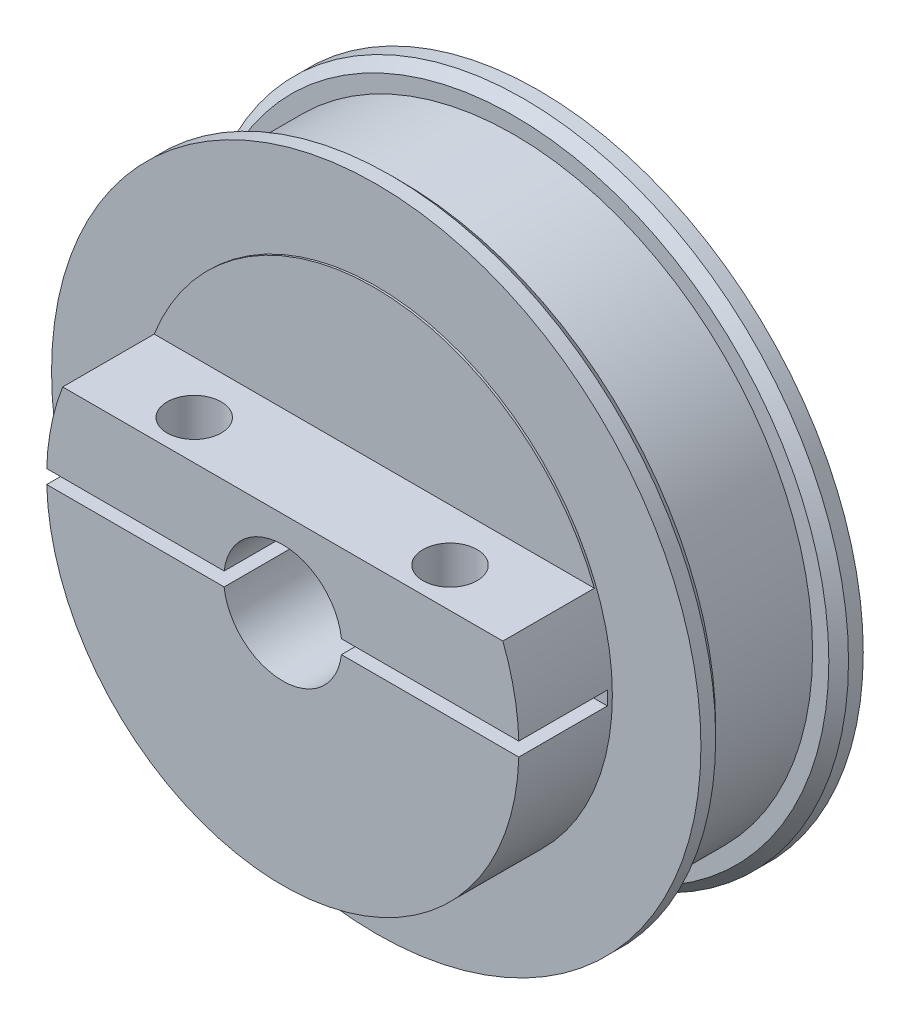
ISO-10303-21;
HEADER;
FILE_DESCRIPTION(('STEP AP214'),'2;1');
FILE_NAME('part.step','',(''),(''),'','','');
FILE_SCHEMA(('AUTOMOTIVE_DESIGN { 1 0 10303 214 1 1 1 1 }'));
ENDSEC;
DATA;
#1=APPLICATION_CONTEXT('core data for automotive mechanical design processes');
#2=APPLICATION_PROTOCOL_DEFINITION('international standard','automotive_design',2000,#1);
#3=PRODUCT_CONTEXT('',#1,'mechanical');
#4=PRODUCT('Part','Part','',(#3));
#5=PRODUCT_RELATED_PRODUCT_CATEGORY('part','',(#4));
#6=PRODUCT_DEFINITION_FORMATION('','',#4);
#7=PRODUCT_DEFINITION_CONTEXT('part definition',#1,'design');
#8=PRODUCT_DEFINITION('design','',#6,#7);
#9=PRODUCT_DEFINITION_SHAPE('','',#8);
#10=(LENGTH_UNIT() NAMED_UNIT(*) SI_UNIT(.MILLI.,.METRE.));
#11=(NAMED_UNIT(*) PLANE_ANGLE_UNIT() SI_UNIT($,.RADIAN.));
#12=(NAMED_UNIT(*) SI_UNIT($,.STERADIAN.) SOLID_ANGLE_UNIT());
#13=UNCERTAINTY_MEASURE_WITH_UNIT(LENGTH_MEASURE(1.E-05),#10,'distance_accuracy_value','');
#14=(GEOMETRIC_REPRESENTATION_CONTEXT(3) GLOBAL_UNCERTAINTY_ASSIGNED_CONTEXT((#13)) GLOBAL_UNIT_ASSIGNED_CONTEXT((#10,
#11,#12)) REPRESENTATION_CONTEXT('',''));
#15=CARTESIAN_POINT('',(0.,0.,0.));
#16=DIRECTION('',(0.,0.,1.));
#17=DIRECTION('',(1.,0.,0.));
#18=AXIS2_PLACEMENT_3D('',#15,#16,#17);
#19=CARTESIAN_POINT('',(0.,0.,26.));
#20=DIRECTION('',(0.,0.,1.));
#21=DIRECTION('',(1.,0.,0.));
#22=AXIS2_PLACEMENT_3D('',#19,#20,#21);
#23=PLANE('',#22);
#24=DIRECTION('',(1.,0.,0.));
#25=VECTOR('',#24,1.);
#26=CARTESIAN_POINT('',(0.,8.7,26.));
#27=LINE('',#26,#25);
#28=CARTESIAN_POINT('',(-22.3676105116304,8.7,26.));
#29=VERTEX_POINT('',#28);
#30=CARTESIAN_POINT('',(22.3676105116304,8.7,26.));
#31=VERTEX_POINT('',#30);
#32=EDGE_CURVE('E110',#29,#31,#27,.T.);
#33=ORIENTED_EDGE('',*,*,#32,.F.);
#34=CARTESIAN_POINT('',(0.,0.,26.));
#35=DIRECTION('',(0.,0.,1.));
#36=DIRECTION('',(1.,0.,0.));
#37=AXIS2_PLACEMENT_3D('',#34,#35,#36);
#38=CIRCLE('',#37,24.);
#39=CARTESIAN_POINT('',(-23.9897894946996,0.699999999999999,26.));
#40=VERTEX_POINT('',#39);
#41=EDGE_CURVE('E114',#29,#40,#38,.T.);
#42=ORIENTED_EDGE('',*,*,#41,.T.);
#43=DIRECTION('',(-1.,0.,0.));
#44=VECTOR('',#43,1.);
#45=CARTESIAN_POINT('',(-25.,0.699999999999999,26.));
#46=LINE('',#45,#44);
#47=CARTESIAN_POINT('',(-5.95902676617583,0.700000000000001,26.));
#48=VERTEX_POINT('',#47);
#49=EDGE_CURVE('E456',#48,#40,#46,.T.);
#50=ORIENTED_EDGE('',*,*,#49,.F.);
#51=CARTESIAN_POINT('',(0.,0.,26.));
#52=DIRECTION('',(0.,0.,1.));
#53=DIRECTION('',(1.,0.,0.));
#54=AXIS2_PLACEMENT_3D('',#51,#52,#53);
#55=CIRCLE('',#54,6.);
#56=CARTESIAN_POINT('',(5.95902676617583,0.700000000000003,26.));
#57=VERTEX_POINT('',#56);
#58=EDGE_CURVE('E148',#57,#48,#55,.T.);
#59=ORIENTED_EDGE('',*,*,#58,.F.);
#60=CARTESIAN_POINT('',(23.9897894946996,0.700000000000005,26.));
#61=VERTEX_POINT('',#60);
#62=EDGE_CURVE('E455',#61,#57,#46,.T.);
#63=ORIENTED_EDGE('',*,*,#62,.F.);
#64=EDGE_CURVE('E118',#61,#31,#38,.T.);
#65=ORIENTED_EDGE('',*,*,#64,.T.);
#66=EDGE_LOOP('',(#33,#42,#50,#59,#63,#65));
#67=FACE_BOUND('',#66,.T.);
#68=ADVANCED_FACE('F35',(#67),#23,.T.);
#69=CARTESIAN_POINT('',(0.,0.,16.5));
#70=DIRECTION('',(0.,0.,1.));
#71=DIRECTION('',(1.,0.,0.));
#72=AXIS2_PLACEMENT_3D('',#69,#70,#71);
#73=PLANE('',#72);
#74=CARTESIAN_POINT('',(0.,0.,16.5));
#75=DIRECTION('',(0.,0.,1.));
#76=DIRECTION('',(1.,0.,0.));
#77=AXIS2_PLACEMENT_3D('',#74,#75,#76);
#78=CIRCLE('',#77,33.);
#79=CARTESIAN_POINT('',(33.,0.,16.5));
#80=VERTEX_POINT('',#79);
#81=EDGE_CURVE('E143',#80,#80,#78,.T.);
#82=ORIENTED_EDGE('',*,*,#81,.T.);
#83=EDGE_LOOP('',(#82));
#84=FACE_BOUND('',#83,.T.);
#85=CARTESIAN_POINT('',(0.,0.,16.5));
#86=DIRECTION('',(0.,0.,1.));
#87=DIRECTION('',(1.,0.,0.));
#88=AXIS2_PLACEMENT_3D('',#85,#86,#87);
#89=CIRCLE('',#88,24.);
#90=CARTESIAN_POINT('',(24.,0.,16.5));
#91=VERTEX_POINT('',#90);
#92=EDGE_CURVE('E145',#91,#91,#89,.T.);
#93=ORIENTED_EDGE('',*,*,#92,.F.);
#94=EDGE_LOOP('',(#93));
#95=FACE_BOUND('',#94,.T.);
#96=ADVANCED_FACE('F252',(#84,#95),#73,.T.);
#97=CARTESIAN_POINT('',(0.,0.,2.5));
#98=DIRECTION('',(0.,0.,1.));
#99=DIRECTION('',(1.,0.,0.));
#100=AXIS2_PLACEMENT_3D('',#97,#98,#99);
#101=PLANE('',#100);
#102=CARTESIAN_POINT('',(0.,0.,2.5));
#103=DIRECTION('',(0.,0.,1.));
#104=DIRECTION('',(1.,0.,0.));
#105=AXIS2_PLACEMENT_3D('',#102,#103,#104);
#106=CIRCLE('',#105,32.);
#107=CARTESIAN_POINT('',(32.,0.,2.5));
#108=VERTEX_POINT('',#107);
#109=EDGE_CURVE('E164',#108,#108,#106,.T.);
#110=ORIENTED_EDGE('',*,*,#109,.T.);
#111=EDGE_LOOP('',(#110));
#112=FACE_BOUND('',#111,.T.);
#113=CARTESIAN_POINT('',(0.,0.,2.5));
#114=DIRECTION('',(0.,0.,1.));
#115=DIRECTION('',(1.,0.,0.));
#116=AXIS2_PLACEMENT_3D('',#113,#114,#115);
#117=CIRCLE('',#116,30.35);
#118=CARTESIAN_POINT('',(30.35,0.,2.5));
#119=VERTEX_POINT('',#118);
#120=EDGE_CURVE('E155',#119,#119,#117,.T.);
#121=ORIENTED_EDGE('',*,*,#120,.F.);
#122=EDGE_LOOP('',(#121));
#123=FACE_BOUND('',#122,.T.);
#124=ADVANCED_FACE('F256',(#112,#123),#101,.T.);
#125=CARTESIAN_POINT('',(0.,0.,2.5));
#126=DIRECTION('',(0.,0.,-1.));
#127=DIRECTION('',(-1.,0.,0.));
#128=AXIS2_PLACEMENT_3D('',#125,#126,#127);
#129=CYLINDRICAL_SURFACE('',#128,33.);
#130=CARTESIAN_POINT('',(0.,0.,1.49999999999999));
#131=DIRECTION('',(0.,0.,1.));
#132=DIRECTION('',(1.,0.,0.));
#133=AXIS2_PLACEMENT_3D('',#130,#131,#132);
#134=CIRCLE('',#133,33.);
#135=CARTESIAN_POINT('',(33.,0.,1.49999999999999));
#136=VERTEX_POINT('',#135);
#137=EDGE_CURVE('E167',#136,#136,#134,.F.);
#138=ORIENTED_EDGE('',*,*,#137,.T.);
#139=EDGE_LOOP('',(#138));
#140=FACE_BOUND('',#139,.T.);
#141=CARTESIAN_POINT('',(0.,0.,0.));
#142=DIRECTION('',(0.,0.,1.));
#143=DIRECTION('',(1.,0.,0.));
#144=AXIS2_PLACEMENT_3D('',#141,#142,#143);
#145=CIRCLE('',#144,33.);
#146=CARTESIAN_POINT('',(33.,0.,0.));
#147=VERTEX_POINT('',#146);
#148=EDGE_CURVE('E159',#147,#147,#145,.T.);
#149=ORIENTED_EDGE('',*,*,#148,.T.);
#150=EDGE_LOOP('',(#149));
#151=FACE_BOUND('',#150,.T.);
#152=ADVANCED_FACE('F261',(#140,#151),#129,.T.);
#153=CARTESIAN_POINT('',(0.,0.,0.));
#154=DIRECTION('',(0.,0.,1.));
#155=DIRECTION('',(1.,0.,0.));
#156=AXIS2_PLACEMENT_3D('',#153,#154,#155);
#157=PLANE('',#156);
#158=CARTESIAN_POINT('',(0.,0.,0.));
#159=DIRECTION('',(0.,0.,1.));
#160=DIRECTION('',(1.,0.,0.));
#161=AXIS2_PLACEMENT_3D('',#158,#159,#160);
#162=CIRCLE('',#161,6.);
#163=CARTESIAN_POINT('',(6.,0.,0.));
#164=VERTEX_POINT('',#163);
#165=EDGE_CURVE('E152',#164,#164,#162,.T.);
#166=ORIENTED_EDGE('',*,*,#165,.T.);
#167=EDGE_LOOP('',(#166));
#168=FACE_BOUND('',#167,.T.);
#169=ORIENTED_EDGE('',*,*,#148,.F.);
#170=EDGE_LOOP('',(#169));
#171=FACE_BOUND('',#170,.T.);
#172=ADVANCED_FACE('F275',(#168,#171),#157,.F.);
#173=CARTESIAN_POINT('',(0.,0.,14.));
#174=DIRECTION('',(0.,0.,-1.));
#175=DIRECTION('',(-1.,0.,0.));
#176=AXIS2_PLACEMENT_3D('',#173,#174,#175);
#177=CYLINDRICAL_SURFACE('',#176,30.35);
#178=CARTESIAN_POINT('',(0.,0.,14.));
#179=DIRECTION('',(0.,0.,1.));
#180=DIRECTION('',(1.,0.,0.));
#181=AXIS2_PLACEMENT_3D('',#178,#179,#180);
#182=CIRCLE('',#181,30.35);
#183=CARTESIAN_POINT('',(30.35,0.,14.));
#184=VERTEX_POINT('',#183);
#185=EDGE_CURVE('E156',#184,#184,#182,.T.);
#186=ORIENTED_EDGE('',*,*,#185,.F.);
#187=EDGE_LOOP('',(#186));
#188=FACE_BOUND('',#187,.T.);
#189=ORIENTED_EDGE('',*,*,#120,.T.);
#190=EDGE_LOOP('',(#189));
#191=FACE_BOUND('',#190,.T.);
#192=ADVANCED_FACE('F269',(#188,#191),#177,.T.);
#193=CARTESIAN_POINT('',(0.,0.,14.));
#194=DIRECTION('',(0.,0.,1.));
#195=DIRECTION('',(1.,0.,0.));
#196=AXIS2_PLACEMENT_3D('',#193,#194,#195);
#197=PLANE('',#196);
#198=CARTESIAN_POINT('',(0.,0.,14.));
#199=DIRECTION('',(0.,0.,1.));
#200=DIRECTION('',(1.,0.,0.));
#201=AXIS2_PLACEMENT_3D('',#198,#199,#200);
#202=CIRCLE('',#201,32.);
#203=CARTESIAN_POINT('',(32.,0.,14.));
#204=VERTEX_POINT('',#203);
#205=EDGE_CURVE('E173',#204,#204,#202,.F.);
#206=ORIENTED_EDGE('',*,*,#205,.T.);
#207=EDGE_LOOP('',(#206));
#208=FACE_BOUND('',#207,.T.);
#209=ORIENTED_EDGE('',*,*,#185,.T.);
#210=EDGE_LOOP('',(#209));
#211=FACE_BOUND('',#210,.T.);
#212=ADVANCED_FACE('F266',(#208,#211),#197,.F.);
#213=CARTESIAN_POINT('',(0.,0.,16.5));
#214=DIRECTION('',(0.,0.,-1.));
#215=DIRECTION('',(-1.,0.,0.));
#216=AXIS2_PLACEMENT_3D('',#213,#214,#215);
#217=CYLINDRICAL_SURFACE('',#216,33.);
#218=CARTESIAN_POINT('',(0.,0.,15.));
#219=DIRECTION('',(0.,0.,1.));
#220=DIRECTION('',(1.,0.,0.));
#221=AXIS2_PLACEMENT_3D('',#218,#219,#220);
#222=CIRCLE('',#221,33.);
#223=CARTESIAN_POINT('',(33.,0.,15.));
#224=VERTEX_POINT('',#223);
#225=EDGE_CURVE('E170',#224,#224,#222,.T.);
#226=ORIENTED_EDGE('',*,*,#225,.T.);
#227=EDGE_LOOP('',(#226));
#228=FACE_BOUND('',#227,.T.);
#229=ORIENTED_EDGE('',*,*,#81,.F.);
#230=EDGE_LOOP('',(#229));
#231=FACE_BOUND('',#230,.T.);
#232=ADVANCED_FACE('F249',(#228,#231),#217,.T.);
#233=CARTESIAN_POINT('',(0.,0.,26.));
#234=DIRECTION('',(0.,0.,-1.));
#235=DIRECTION('',(-1.,0.,0.));
#236=AXIS2_PLACEMENT_3D('',#233,#234,#235);
#237=CYLINDRICAL_SURFACE('',#236,24.);
#238=ORIENTED_EDGE('',*,*,#41,.F.);
#239=DIRECTION('',(0.,0.,-1.));
#240=VECTOR('',#239,1.);
#241=CARTESIAN_POINT('',(-22.3676105116304,8.7,26.));
#242=LINE('',#241,#240);
#243=CARTESIAN_POINT('',(-22.3676105116304,8.7,16.7));
#244=VERTEX_POINT('',#243);
#245=EDGE_CURVE('E126',#29,#244,#242,.T.);
#246=ORIENTED_EDGE('',*,*,#245,.T.);
#247=CARTESIAN_POINT('',(0.,0.,16.7));
#248=DIRECTION('',(0.,0.,1.));
#249=DIRECTION('',(1.,0.,0.));
#250=AXIS2_PLACEMENT_3D('',#247,#248,#249);
#251=CIRCLE('',#250,24.);
#252=CARTESIAN_POINT('',(22.3676105116304,8.7,16.7));
#253=VERTEX_POINT('',#252);
#254=EDGE_CURVE('E11',#253,#244,#251,.T.);
#255=ORIENTED_EDGE('',*,*,#254,.F.);
#256=DIRECTION('',(0.,0.,-1.));
#257=VECTOR('',#256,1.);
#258=CARTESIAN_POINT('',(22.3676105116304,8.7,26.));
#259=LINE('',#258,#257);
#260=EDGE_CURVE('E134',#253,#31,#259,.F.);
#261=ORIENTED_EDGE('',*,*,#260,.T.);
#262=ORIENTED_EDGE('',*,*,#64,.F.);
#263=DIRECTION('',(0.,0.,-1.));
#264=VECTOR('',#263,1.);
#265=CARTESIAN_POINT('',(23.9897894946996,0.700000000000005,26.));
#266=LINE('',#265,#264);
#267=CARTESIAN_POINT('',(23.9897894946996,0.700000000000005,17.));
#268=VERTEX_POINT('',#267);
#269=EDGE_CURVE('E439',#61,#268,#266,.T.);
#270=ORIENTED_EDGE('',*,*,#269,.T.);
#271=CARTESIAN_POINT('',(0.,0.,17.));
#272=DIRECTION('',(0.,0.,1.));
#273=DIRECTION('',(1.,0.,0.));
#274=AXIS2_PLACEMENT_3D('',#271,#272,#273);
#275=CIRCLE('',#274,24.);
#276=CARTESIAN_POINT('',(23.9897894946996,-0.699999999999996,17.));
#277=VERTEX_POINT('',#276);
#278=EDGE_CURVE('E431',#277,#268,#275,.T.);
#279=ORIENTED_EDGE('',*,*,#278,.F.);
#280=DIRECTION('',(0.,0.,-1.));
#281=VECTOR('',#280,1.);
#282=CARTESIAN_POINT('',(23.9897894946996,-0.699999999999996,26.));
#283=LINE('',#282,#281);
#284=CARTESIAN_POINT('',(23.9897894946996,-0.699999999999996,26.));
#285=VERTEX_POINT('',#284);
#286=EDGE_CURVE('E463',#277,#285,#283,.F.);
#287=ORIENTED_EDGE('',*,*,#286,.T.);
#288=CARTESIAN_POINT('',(-23.9897894946996,-0.700000000000002,26.));
#289=VERTEX_POINT('',#288);
#290=EDGE_CURVE('E141',#289,#285,#38,.T.);
#291=ORIENTED_EDGE('',*,*,#290,.F.);
#292=DIRECTION('',(0.,0.,-1.));
#293=VECTOR('',#292,1.);
#294=CARTESIAN_POINT('',(-23.9897894946996,-0.700000000000002,26.));
#295=LINE('',#294,#293);
#296=CARTESIAN_POINT('',(-23.9897894946996,-0.700000000000002,17.));
#297=VERTEX_POINT('',#296);
#298=EDGE_CURVE('E446',#289,#297,#295,.T.);
#299=ORIENTED_EDGE('',*,*,#298,.T.);
#300=CARTESIAN_POINT('',(-23.9897894946996,0.699999999999999,17.));
#301=VERTEX_POINT('',#300);
#302=EDGE_CURVE('E436',#301,#297,#275,.T.);
#303=ORIENTED_EDGE('',*,*,#302,.F.);
#304=DIRECTION('',(0.,0.,-1.));
#305=VECTOR('',#304,1.);
#306=CARTESIAN_POINT('',(-23.9897894946996,0.699999999999999,26.));
#307=LINE('',#306,#305);
#308=EDGE_CURVE('E140',#301,#40,#307,.F.);
#309=ORIENTED_EDGE('',*,*,#308,.T.);
#310=EDGE_LOOP('',(#238,#246,#255,#261,#262,#270,#279,#287,#291,#299,#303,#309));
#311=FACE_BOUND('',#310,.T.);
#312=CARTESIAN_POINT('',(-13.,-20.174241001832,24.1));
#313=CARTESIAN_POINT('',(-12.849288157179,-20.2713551716352,24.0999969433963));
#314=CARTESIAN_POINT('',(-12.697399910894,-20.3668149132256,24.0837824875346));
#315=CARTESIAN_POINT('',(-12.3969170998205,-20.5510938041406,24.0174049459555));
#316=CARTESIAN_POINT('',(-12.2483212330184,-20.6399156127295,23.967255536972));
#317=CARTESIAN_POINT('',(-11.9794450419192,-20.7969731415149,23.8405754693289));
#318=CARTESIAN_POINT('',(-11.8579460485274,-20.8663944712,23.768121475505));
#319=CARTESIAN_POINT('',(-11.6287946661962,-20.9949601498911,23.596923542887));
#320=CARTESIAN_POINT('',(-11.5211225617998,-21.0541191749173,23.4982176673926));
#321=CARTESIAN_POINT('',(-11.340647640857,-21.1518011292401,23.2931950904712));
#322=CARTESIAN_POINT('',(-11.2650412040748,-21.1920838688733,23.1901845577408));
#323=CARTESIAN_POINT('',(-11.132723403254,-21.2618928667944,22.9694219540343));
#324=CARTESIAN_POINT('',(-11.0759923207704,-21.2914303533175,22.8516854448861));
#325=CARTESIAN_POINT('',(-10.9910384144899,-21.3353945059791,22.6221028742834));
#326=CARTESIAN_POINT('',(-10.9600200464264,-21.351312457034,22.5115702352565));
#327=CARTESIAN_POINT('',(-10.91640559265,-21.373645135915,22.2860101784045));
#328=CARTESIAN_POINT('',(-10.9037993499169,-21.3800651033143,22.170985274717));
#329=CARTESIAN_POINT('',(-10.8979046042035,-21.3830697980633,21.9489396954555));
#330=CARTESIAN_POINT('',(-10.9032457690739,-21.3803521928256,21.8419617133724));
#331=CARTESIAN_POINT('',(-10.9300050393064,-21.3666846539916,21.630590492442));
#332=CARTESIAN_POINT('',(-10.951420902534,-21.3557358684985,21.5261968952165));
#333=CARTESIAN_POINT('',(-11.0090880259167,-21.3260640926489,21.3237976015672));
#334=CARTESIAN_POINT('',(-11.0452067264089,-21.3074105463255,21.2257436712989));
#335=CARTESIAN_POINT('',(-11.1307404682853,-21.2628533245368,21.0374143255193));
#336=CARTESIAN_POINT('',(-11.1801574561433,-21.2369485876908,20.9471400512739));
#337=CARTESIAN_POINT('',(-11.2931045679551,-21.1771116034468,20.7720390165985));
#338=CARTESIAN_POINT('',(-11.3572081761813,-21.1428478554889,20.6876968445316));
#339=CARTESIAN_POINT('',(-11.4955887440155,-21.0679288837374,20.5310960825113));
#340=CARTESIAN_POINT('',(-11.5698690513904,-21.0272715560334,20.4588414863795));
#341=CARTESIAN_POINT('',(-11.7337800806294,-20.9362841464911,20.3209429566493));
#342=CARTESIAN_POINT('',(-11.8242001955834,-20.8853996206159,20.2566057106992));
#343=CARTESIAN_POINT('',(-12.0115461706161,-20.7782199434862,20.143949023162));
#344=CARTESIAN_POINT('',(-12.1084750536091,-20.7219222728498,20.0956370870652));
#345=CARTESIAN_POINT('',(-12.3189694389339,-20.5975666373773,20.0098469200332));
#346=CARTESIAN_POINT('',(-12.4330768783874,-20.5289255632783,19.9745454337949));
#347=CARTESIAN_POINT('',(-12.663254729758,-20.3877475645518,19.9238227623137));
#348=CARTESIAN_POINT('',(-12.7793260234728,-20.3152088562192,19.9084107613719));
#349=CARTESIAN_POINT('',(-13.0260507297157,-20.1580272850201,19.8960736228558));
#350=CARTESIAN_POINT('',(-13.1566238427027,-20.0730430295922,19.9018328384013));
#351=CARTESIAN_POINT('',(-13.4139287752807,-19.9020208685234,19.9371012230994));
#352=CARTESIAN_POINT('',(-13.5406569490221,-19.8159820651597,19.9666322451444));
#353=CARTESIAN_POINT('',(-13.7975281548705,-19.6380897708855,20.0522401057887));
#354=CARTESIAN_POINT('',(-13.9270881107708,-19.5463432522373,20.1103087733295));
#355=CARTESIAN_POINT('',(-14.1743496835975,-19.367782640486,20.2532150127494));
#356=CARTESIAN_POINT('',(-14.2920617594735,-19.280964227058,20.3380286966223));
#357=CARTESIAN_POINT('',(-14.4837748177655,-19.137160798849,20.5098210967681));
#358=CARTESIAN_POINT('',(-14.5613816991587,-19.0781119902699,20.5910625498442));
#359=CARTESIAN_POINT('',(-14.704579784096,-18.9679587470009,20.7681997310564));
#360=CARTESIAN_POINT('',(-14.7701888495835,-18.9168425200127,20.8640732784962));
#361=CARTESIAN_POINT('',(-14.8757663375284,-18.8338860220432,21.0508701982227));
#362=CARTESIAN_POINT('',(-14.9182246143305,-18.8002321273904,21.1395742968585));
#363=CARTESIAN_POINT('',(-14.9909577037473,-18.7422879405941,21.3247520312532));
#364=CARTESIAN_POINT('',(-15.0212393287349,-18.7179924131216,21.4212212863422));
#365=CARTESIAN_POINT('',(-15.0679218182441,-18.6804351175815,21.6202582911522));
#366=CARTESIAN_POINT('',(-15.084234136541,-18.667243743445,21.7228605967605));
#367=CARTESIAN_POINT('',(-15.1014102238641,-18.6533521056796,21.9301793125208));
#368=CARTESIAN_POINT('',(-15.1022816460848,-18.6526456539688,22.0348946495923));
#369=CARTESIAN_POINT('',(-15.0892719845803,-18.6631699617008,22.2315542580634));
#370=CARTESIAN_POINT('',(-15.0769434165631,-18.6731444946906,22.3236766238946));
#371=CARTESIAN_POINT('',(-15.0406833165537,-18.7023629933204,22.5040613102457));
#372=CARTESIAN_POINT('',(-15.0167502313168,-18.721608199822,22.5923231123112));
#373=CARTESIAN_POINT('',(-14.9577331267345,-18.7687952095334,22.7654282152351));
#374=CARTESIAN_POINT('',(-14.9223589692519,-18.7969628473805,22.8501094216407));
#375=CARTESIAN_POINT('',(-14.8422505477,-18.8602810812771,23.0120708041663));
#376=CARTESIAN_POINT('',(-14.7975125409588,-18.8954344692022,23.0893480028923));
#377=CARTESIAN_POINT('',(-14.6923433016774,-18.9773591436896,23.2475528842281));
#378=CARTESIAN_POINT('',(-14.6305454743905,-19.0250896154251,23.3270710783559));
#379=CARTESIAN_POINT('',(-14.498382428668,-19.1259989567143,23.4746801949293));
#380=CARTESIAN_POINT('',(-14.4280113881459,-19.1791815248684,23.5427632762886));
#381=CARTESIAN_POINT('',(-14.2646468313247,-19.3010957028801,23.680590890653));
#382=CARTESIAN_POINT('',(-14.1700247381988,-19.3707289840857,23.7476103393658));
#383=CARTESIAN_POINT('',(-13.9730274726646,-19.5133116020224,23.864498080832));
#384=CARTESIAN_POINT('',(-13.8706477800792,-19.586262862014,23.9143562788781));
#385=CARTESIAN_POINT('',(-13.6436095624056,-19.7452262191979,24.0032113281213));
#386=CARTESIAN_POINT('',(-13.5179743859416,-19.8314931201679,24.0392805410176));
#387=CARTESIAN_POINT('',(-13.261860215082,-20.0036729875382,24.0876866288356));
#388=CARTESIAN_POINT('',(-13.1313770696215,-20.089585577224,24.100002664473));
#389=CARTESIAN_POINT('',(-13.,-20.174241001832,24.1));
#390=B_SPLINE_CURVE_WITH_KNOTS('',3,(#312,#313,#314,#315,#316,#317,#318,#319,#320,#321,#322,
#323,#324,#325,#326,#327,#328,#329,#330,#331,#332,#333,#334,#335,#336,#337,#338,#339,#340,#341,
#342,#343,#344,#345,#346,#347,#348,#349,#350,#351,#352,#353,#354,#355,#356,#357,#358,#359,#360,
#361,#362,#363,#364,#365,#366,#367,#368,#369,#370,#371,#372,#373,#374,#375,#376,#377,#378,#379,
#380,#381,#382,#383,#384,#385,#386,#387,#388,#389),.UNSPECIFIED.,.T.,.F.,(4,2,2,2,2,2,2,2,2,2,2,
2,2,2,2,2,2,2,2,2,2,2,2,2,2,2,2,2,2,2,2,2,2,2,2,2,2,2,4),(0.,0.537221309699028,1.07422623306057,
1.54416868940228,2.01343344366252,2.41302160335044,2.81219100642574,3.15804836605943,
3.50371486186524,3.8236068379346,4.1434542030489,4.46047955841181,4.77755134211774,
5.11017985697839,5.44291805853934,5.80769917780284,6.17265090269523,6.58429265684936,
6.99612442550116,7.4618712080665,7.92804663089014,8.4327416464478,8.93698715128983,
9.31636281645884,9.69516899820866,10.0057388091831,10.3161346256221,10.6284836626186,
10.9406778812166,11.2198107714315,11.4989810334221,11.7858735402894,12.0728809360189,
12.4060168814708,12.7393803346735,13.1436295384867,13.5481161277542,14.0160071840321,
14.4843085469866),.UNSPECIFIED.);
#391=CARTESIAN_POINT('',(-13.,-20.174241001832,24.1));
#392=VERTEX_POINT('',#391);
#393=EDGE_CURVE('E198',#392,#392,#390,.T.);
#394=ORIENTED_EDGE('',*,*,#393,.T.);
#395=EDGE_LOOP('',(#394));
#396=FACE_BOUND('',#395,.T.);
#397=CARTESIAN_POINT('',(13.,-20.174241001832,24.1));
#398=CARTESIAN_POINT('',(13.1501267713471,-20.0774981590407,24.0999981787219));
#399=CARTESIAN_POINT('',(13.2992344719462,-19.979020099521,24.0839054720338));
#400=CARTESIAN_POINT('',(13.5908293099329,-19.78182081246,24.0207000606302));
#401=CARTESIAN_POINT('',(13.7333062391205,-19.6830994413188,23.97354111693));
#402=CARTESIAN_POINT('',(13.9994829529944,-19.494604509476,23.8523586674659));
#403=CARTESIAN_POINT('',(14.1237852580266,-19.4046379372412,23.779963414446));
#404=CARTESIAN_POINT('',(14.3580088810165,-19.2319690961474,23.6083544775844));
#405=CARTESIAN_POINT('',(14.4679609765234,-19.1492514098592,23.5091996367402));
#406=CARTESIAN_POINT('',(14.6375427561951,-19.0197288098497,23.3188623509945));
#407=CARTESIAN_POINT('',(14.7023013570543,-18.9696576022825,23.2344443089444));
#408=CARTESIAN_POINT('',(14.8198146948642,-18.877993102472,23.0535020673965));
#409=CARTESIAN_POINT('',(14.8725861341525,-18.8363880224634,22.9569950068833));
#410=CARTESIAN_POINT('',(14.9563190562648,-18.7699477229566,22.7692098455592));
#411=CARTESIAN_POINT('',(14.989394599173,-18.7435117778632,22.6794459763427));
#412=CARTESIAN_POINT('',(15.0433247102771,-18.7002563403524,22.494085016804));
#413=CARTESIAN_POINT('',(15.0641859800839,-18.683431574688,22.3984911570776));
#414=CARTESIAN_POINT('',(15.0924321413794,-18.6606226186674,22.2036100940559));
#415=CARTESIAN_POINT('',(15.0997596126003,-18.6546846187098,22.1043089695129));
#416=CARTESIAN_POINT('',(15.1002285701758,-18.6543050990493,21.9056542369005));
#417=CARTESIAN_POINT('',(15.0933716206731,-18.6598623117479,21.8063006358256));
#418=CARTESIAN_POINT('',(15.066956125713,-18.6811959809353,21.6177482797019));
#419=CARTESIAN_POINT('',(15.0483312033494,-18.6962210758185,21.5283285792871));
#420=CARTESIAN_POINT('',(15.0003274119666,-18.7347569427197,21.3543695728121));
#421=CARTESIAN_POINT('',(14.9709462690636,-18.7582695089892,21.2698313030731));
#422=CARTESIAN_POINT('',(14.900366630545,-18.814389081962,21.1013728292614));
#423=CARTESIAN_POINT('',(14.8584787981455,-18.8475220738365,21.0179200542329));
#424=CARTESIAN_POINT('',(14.7656294102416,-18.9203506867286,20.8593836165826));
#425=CARTESIAN_POINT('',(14.7146633799169,-18.9600495434959,20.7843041111225));
#426=CARTESIAN_POINT('',(14.59518941712,-19.0522206078587,20.6301320518995));
#427=CARTESIAN_POINT('',(14.5251777375972,-19.1057014695258,20.5528112981554));
#428=CARTESIAN_POINT('',(14.3767444964803,-19.2176450858816,20.4109332172284));
#429=CARTESIAN_POINT('',(14.2983172251752,-19.276111217323,20.3463846410917));
#430=CARTESIAN_POINT('',(14.1174062524032,-19.4091199148963,20.217814017092));
#431=CARTESIAN_POINT('',(14.0133481030785,-19.4844423391571,20.1568067261953));
#432=CARTESIAN_POINT('',(13.7979075366273,-19.6375982493071,20.0538195749942));
#433=CARTESIAN_POINT('',(13.6865200633558,-19.7154334493779,20.0118530109264));
#434=CARTESIAN_POINT('',(13.44119690163,-19.8836498843877,19.9423369320862));
#435=CARTESIAN_POINT('',(13.3064159409859,-19.974131419255,19.9179688387228));
#436=CARTESIAN_POINT('',(13.0334324195535,-20.1533203857353,19.8958033727487));
#437=CARTESIAN_POINT('',(12.8952283580453,-20.2420270072594,19.8980178675797));
#438=CARTESIAN_POINT('',(12.6157842636484,-20.4173907226684,19.9305431523531));
#439=CARTESIAN_POINT('',(12.4745554489101,-20.5039399033848,19.9615602742646));
#440=CARTESIAN_POINT('',(12.1977345430424,-20.6698151670396,20.0538210261493));
#441=CARTESIAN_POINT('',(12.0621393836581,-20.7491452105173,20.1150479626531));
#442=CARTESIAN_POINT('',(11.8156611263499,-20.8903893990291,20.2605233176622));
#443=CARTESIAN_POINT('',(11.7036578211413,-20.9532477038996,20.3419407522805));
#444=CARTESIAN_POINT('',(11.4951306376331,-21.0683683301127,20.528648109179));
#445=CARTESIAN_POINT('',(11.3985871294383,-21.1206441111452,20.6339073417006));
#446=CARTESIAN_POINT('',(11.2397608628849,-21.2055344264129,20.8482073063307));
#447=CARTESIAN_POINT('',(11.1745179719783,-21.2399169040777,20.9543563761219));
#448=CARTESIAN_POINT('',(11.0631458778713,-21.2981402514717,21.178874548846));
#449=CARTESIAN_POINT('',(11.0169984929352,-21.3219911502749,21.2972318929047));
#450=CARTESIAN_POINT('',(10.9509372728331,-21.3559870215175,21.5268873004661));
#451=CARTESIAN_POINT('',(10.9284992754775,-21.3674546646858,21.6372695334279));
#452=CARTESIAN_POINT('',(10.9016064154404,-21.3811884200274,21.8607529093438));
#453=CARTESIAN_POINT('',(10.8971434942054,-21.3834586555685,21.9738528110348));
#454=CARTESIAN_POINT('',(10.9061397962244,-21.3788710219699,22.1923186503085));
#455=CARTESIAN_POINT('',(10.9185408642651,-21.3725521024551,22.2977418373124));
#456=CARTESIAN_POINT('',(10.9588389688705,-21.3519169015532,22.5047561129009));
#457=CARTESIAN_POINT('',(10.9867349904744,-21.3376011439799,22.6063474520163));
#458=CARTESIAN_POINT('',(11.0569529250422,-21.3012992052659,22.8034734431848));
#459=CARTESIAN_POINT('',(11.0993406457585,-21.2792780223845,22.8989780655941));
#460=CARTESIAN_POINT('',(11.1967660010032,-21.2281757758567,23.0812173870534));
#461=CARTESIAN_POINT('',(11.2518059648451,-21.1990934121714,23.1679504669986));
#462=CARTESIAN_POINT('',(11.3761571884757,-21.1326358068239,23.3359274937749));
#463=CARTESIAN_POINT('',(11.4461290893197,-21.0948661176933,23.4165246331335));
#464=CARTESIAN_POINT('',(11.5955065151435,-21.0131263383074,23.5647636981414));
#465=CARTESIAN_POINT('',(11.6749159150308,-20.9691536998113,23.6324002723789));
#466=CARTESIAN_POINT('',(11.8494520292671,-20.8710686687894,23.7604395004705));
#467=CARTESIAN_POINT('',(11.9453536532459,-20.8163764770705,23.8193387060345));
#468=CARTESIAN_POINT('',(12.1427445266856,-20.7018547723756,23.9202644063657));
#469=CARTESIAN_POINT('',(12.2442351586311,-20.6420239862617,23.9622867049881));
#470=CARTESIAN_POINT('',(12.4543057888004,-20.5159897649507,24.0309854124649));
#471=CARTESIAN_POINT('',(12.5630077357706,-20.449628460585,24.0569956925796));
#472=CARTESIAN_POINT('',(12.7813187428715,-20.3138983176997,24.0915091287559));
#473=CARTESIAN_POINT('',(12.8909283279035,-20.2445276238111,24.100001323214));
#474=CARTESIAN_POINT('',(13.,-20.174241001832,24.1));
#475=B_SPLINE_CURVE_WITH_KNOTS('',3,(#397,#398,#399,#400,#401,#402,#403,#404,#405,#406,#407,
#408,#409,#410,#411,#412,#413,#414,#415,#416,#417,#418,#419,#420,#421,#422,#423,#424,#425,#426,
#427,#428,#429,#430,#431,#432,#433,#434,#435,#436,#437,#438,#439,#440,#441,#442,#443,#444,#445,
#446,#447,#448,#449,#450,#451,#452,#453,#454,#455,#456,#457,#458,#459,#460,#461,#462,#463,#464,
#465,#466,#467,#468,#469,#470,#471,#472,#473,#474),.UNSPECIFIED.,.T.,.F.,(4,2,2,2,2,2,2,2,2,2,2,
2,2,2,2,2,2,2,2,2,2,2,2,2,2,2,2,2,2,2,2,2,2,2,2,2,2,2,4),(0.,0.535272629463088,1.07134376420822,
1.57779646625898,2.08314445250074,2.43463002371754,2.78562280591358,3.08212452439697,
3.378463408323,3.67605671558372,3.97361720842436,4.25011088234736,4.52666304130016,
4.82279311767626,5.11906956831915,5.46946159877722,5.82009288046328,6.24508390506699,
6.67037124802342,7.16062169556716,7.65109101701643,8.15391511121114,8.65646166335493,
9.10994739890111,9.56285268061542,9.94838650450124,10.3335523939743,10.6714566747319,
11.009209449981,11.3267185618244,11.6442068784269,11.9631565136319,12.2821649154558,
12.6204183924994,12.958811234727,13.3327068008932,13.7066952721229,14.0953440255344,
14.4842358947136),.UNSPECIFIED.);
#476=CARTESIAN_POINT('',(13.,-20.174241001832,24.1));
#477=VERTEX_POINT('',#476);
#478=EDGE_CURVE('E190',#477,#477,#475,.T.);
#479=ORIENTED_EDGE('',*,*,#478,.T.);
#480=EDGE_LOOP('',(#479));
#481=FACE_BOUND('',#480,.T.);
#482=ORIENTED_EDGE('',*,*,#92,.T.);
#483=EDGE_LOOP('',(#482));
#484=FACE_BOUND('',#483,.T.);
#485=ADVANCED_FACE('F137',(#311,#396,#481,#484),#237,.T.);
#486=DIRECTION('',(1.,0.,0.));
#487=VECTOR('',#486,1.);
#488=CARTESIAN_POINT('',(-25.,-0.700000000000002,26.));
#489=LINE('',#488,#487);
#490=CARTESIAN_POINT('',(-5.95902676617583,-0.7,26.));
#491=VERTEX_POINT('',#490);
#492=EDGE_CURVE('E458',#289,#491,#489,.T.);
#493=ORIENTED_EDGE('',*,*,#492,.F.);
#494=ORIENTED_EDGE('',*,*,#290,.T.);
#495=CARTESIAN_POINT('',(5.95902676617583,-0.699999999999998,26.));
#496=VERTEX_POINT('',#495);
#497=EDGE_CURVE('E460',#496,#285,#489,.T.);
#498=ORIENTED_EDGE('',*,*,#497,.F.);
#499=EDGE_CURVE('E443',#491,#496,#55,.T.);
#500=ORIENTED_EDGE('',*,*,#499,.F.);
#501=EDGE_LOOP('',(#493,#494,#498,#500));
#502=FACE_BOUND('',#501,.T.);
#503=ADVANCED_FACE('F240',(#502),#23,.T.);
#504=CARTESIAN_POINT('',(0.,0.,2.5));
#505=DIRECTION('',(0.,0.,-1.));
#506=DIRECTION('',(-1.,0.,0.));
#507=AXIS2_PLACEMENT_3D('',#504,#505,#506);
#508=CONICAL_SURFACE('',#507,32.,0.785398163397445);
#509=ORIENTED_EDGE('',*,*,#137,.F.);
#510=EDGE_LOOP('',(#509));
#511=FACE_BOUND('',#510,.T.);
#512=ORIENTED_EDGE('',*,*,#109,.F.);
#513=EDGE_LOOP('',(#512));
#514=FACE_BOUND('',#513,.T.);
#515=ADVANCED_FACE('F242',(#511,#514),#508,.T.);
#516=CARTESIAN_POINT('',(0.,0.,15.));
#517=DIRECTION('',(0.,0.,1.));
#518=DIRECTION('',(1.,0.,0.));
#519=AXIS2_PLACEMENT_3D('',#516,#517,#518);
#520=CONICAL_SURFACE('',#519,33.,0.785398163397452);
#521=ORIENTED_EDGE('',*,*,#205,.F.);
#522=EDGE_LOOP('',(#521));
#523=FACE_BOUND('',#522,.T.);
#524=ORIENTED_EDGE('',*,*,#225,.F.);
#525=EDGE_LOOP('',(#524));
#526=FACE_BOUND('',#525,.T.);
#527=ADVANCED_FACE('F37',(#523,#526),#520,.T.);
#528=CARTESIAN_POINT('',(0.,0.,0.));
#529=DIRECTION('',(0.,0.,1.));
#530=DIRECTION('',(1.,0.,0.));
#531=AXIS2_PLACEMENT_3D('',#528,#529,#530);
#532=CYLINDRICAL_SURFACE('',#531,6.);
#533=ORIENTED_EDGE('',*,*,#58,.T.);
#534=DIRECTION('',(0.,0.,1.));
#535=VECTOR('',#534,1.);
#536=CARTESIAN_POINT('',(-5.95902676617583,0.700000000000001,0.));
#537=LINE('',#536,#535);
#538=CARTESIAN_POINT('',(-5.95902676617583,0.700000000000001,17.));
#539=VERTEX_POINT('',#538);
#540=EDGE_CURVE('E43',#48,#539,#537,.F.);
#541=ORIENTED_EDGE('',*,*,#540,.T.);
#542=CARTESIAN_POINT('',(0.,0.,17.));
#543=DIRECTION('',(0.,0.,1.));
#544=DIRECTION('',(1.,0.,0.));
#545=AXIS2_PLACEMENT_3D('',#542,#543,#544);
#546=CIRCLE('',#545,6.);
#547=CARTESIAN_POINT('',(-5.95902676617583,-0.7,17.));
#548=VERTEX_POINT('',#547);
#549=EDGE_CURVE('E179',#548,#539,#546,.F.);
#550=ORIENTED_EDGE('',*,*,#549,.F.);
#551=DIRECTION('',(0.,0.,1.));
#552=VECTOR('',#551,1.);
#553=CARTESIAN_POINT('',(-5.95902676617583,-0.7,0.));
#554=LINE('',#553,#552);
#555=EDGE_CURVE('E185',#548,#491,#554,.T.);
#556=ORIENTED_EDGE('',*,*,#555,.T.);
#557=ORIENTED_EDGE('',*,*,#499,.T.);
#558=DIRECTION('',(0.,0.,1.));
#559=VECTOR('',#558,1.);
#560=CARTESIAN_POINT('',(5.95902676617583,-0.699999999999998,0.));
#561=LINE('',#560,#559);
#562=CARTESIAN_POINT('',(5.95902676617583,-0.699999999999998,17.));
#563=VERTEX_POINT('',#562);
#564=EDGE_CURVE('E178',#496,#563,#561,.F.);
#565=ORIENTED_EDGE('',*,*,#564,.T.);
#566=CARTESIAN_POINT('',(5.95902676617583,0.700000000000003,17.));
#567=VERTEX_POINT('',#566);
#568=EDGE_CURVE('E176',#567,#563,#546,.F.);
#569=ORIENTED_EDGE('',*,*,#568,.F.);
#570=DIRECTION('',(0.,0.,1.));
#571=VECTOR('',#570,1.);
#572=CARTESIAN_POINT('',(5.95902676617583,0.700000000000003,0.));
#573=LINE('',#572,#571);
#574=EDGE_CURVE('E182',#567,#57,#573,.T.);
#575=ORIENTED_EDGE('',*,*,#574,.T.);
#576=EDGE_LOOP('',(#533,#541,#550,#556,#557,#565,#569,#575));
#577=FACE_BOUND('',#576,.T.);
#578=ORIENTED_EDGE('',*,*,#165,.F.);
#579=EDGE_LOOP('',(#578));
#580=FACE_BOUND('',#579,.T.);
#581=ADVANCED_FACE('F237',(#577,#580),#532,.F.);
#582=CARTESIAN_POINT('',(-25.,-0.700000000000002,17.));
#583=DIRECTION('',(0.,0.,1.));
#584=DIRECTION('',(1.,0.,0.));
#585=AXIS2_PLACEMENT_3D('',#582,#583,#584);
#586=PLANE('',#585);
#587=ORIENTED_EDGE('',*,*,#278,.T.);
#588=DIRECTION('',(-1.,0.,0.));
#589=VECTOR('',#588,1.);
#590=CARTESIAN_POINT('',(-25.,0.699999999999999,17.));
#591=LINE('',#590,#589);
#592=EDGE_CURVE('E58',#268,#567,#591,.T.);
#593=ORIENTED_EDGE('',*,*,#592,.T.);
#594=ORIENTED_EDGE('',*,*,#568,.T.);
#595=DIRECTION('',(1.,0.,0.));
#596=VECTOR('',#595,1.);
#597=CARTESIAN_POINT('',(-25.,-0.700000000000002,17.));
#598=LINE('',#597,#596);
#599=EDGE_CURVE('E433',#563,#277,#598,.T.);
#600=ORIENTED_EDGE('',*,*,#599,.T.);
#601=EDGE_LOOP('',(#587,#593,#594,#600));
#602=FACE_BOUND('',#601,.T.);
#603=ADVANCED_FACE('F227',(#602),#586,.T.);
#604=CARTESIAN_POINT('',(-25.,-0.700000000000002,17.));
#605=DIRECTION('',(0.,-1.,0.));
#606=DIRECTION('',(1.,0.,0.));
#607=AXIS2_PLACEMENT_3D('',#604,#605,#606);
#608=PLANE('',#607);
#609=CARTESIAN_POINT('',(13.,-0.699999999999996,22.));
#610=DIRECTION('',(0.,1.,0.));
#611=DIRECTION('',(0.,0.,1.));
#612=AXIS2_PLACEMENT_3D('',#609,#610,#611);
#613=CIRCLE('',#612,2.09999999999999);
#614=CARTESIAN_POINT('',(13.,-0.699999999999996,24.1));
#615=VERTEX_POINT('',#614);
#616=EDGE_CURVE('E197',#615,#615,#613,.T.);
#617=ORIENTED_EDGE('',*,*,#616,.F.);
#618=EDGE_LOOP('',(#617));
#619=FACE_BOUND('',#618,.T.);
#620=ORIENTED_EDGE('',*,*,#599,.F.);
#621=ORIENTED_EDGE('',*,*,#564,.F.);
#622=ORIENTED_EDGE('',*,*,#497,.T.);
#623=ORIENTED_EDGE('',*,*,#286,.F.);
#624=EDGE_LOOP('',(#620,#621,#622,#623));
#625=FACE_BOUND('',#624,.T.);
#626=ADVANCED_FACE('F232',(#619,#625),#608,.F.);
#627=CARTESIAN_POINT('',(-25.,0.699999999999999,17.));
#628=DIRECTION('',(0.,1.,0.));
#629=DIRECTION('',(-1.,0.,0.));
#630=AXIS2_PLACEMENT_3D('',#627,#628,#629);
#631=PLANE('',#630);
#632=CARTESIAN_POINT('',(13.,0.700000000000004,22.));
#633=DIRECTION('',(0.,-1.,0.));
#634=DIRECTION('',(-1.,0.,0.));
#635=AXIS2_PLACEMENT_3D('',#632,#633,#634);
#636=CIRCLE('',#635,2.75);
#637=CARTESIAN_POINT('',(10.25,0.700000000000003,22.));
#638=VERTEX_POINT('',#637);
#639=EDGE_CURVE('E121',#638,#638,#636,.T.);
#640=ORIENTED_EDGE('',*,*,#639,.F.);
#641=EDGE_LOOP('',(#640));
#642=FACE_BOUND('',#641,.T.);
#643=ORIENTED_EDGE('',*,*,#62,.T.);
#644=ORIENTED_EDGE('',*,*,#574,.F.);
#645=ORIENTED_EDGE('',*,*,#592,.F.);
#646=ORIENTED_EDGE('',*,*,#269,.F.);
#647=EDGE_LOOP('',(#643,#644,#645,#646));
#648=FACE_BOUND('',#647,.T.);
#649=ADVANCED_FACE('F228',(#642,#648),#631,.F.);
#650=CARTESIAN_POINT('',(-13.,0.7,22.));
#651=DIRECTION('',(0.,-1.,0.));
#652=DIRECTION('',(1.,0.,0.));
#653=AXIS2_PLACEMENT_3D('',#650,#651,#652);
#654=CIRCLE('',#653,2.75);
#655=CARTESIAN_POINT('',(-10.25,0.700000000000001,22.));
#656=VERTEX_POINT('',#655);
#657=EDGE_CURVE('E473',#656,#656,#654,.T.);
#658=ORIENTED_EDGE('',*,*,#657,.F.);
#659=EDGE_LOOP('',(#658));
#660=FACE_BOUND('',#659,.T.);
#661=EDGE_CURVE('E441',#539,#301,#591,.T.);
#662=ORIENTED_EDGE('',*,*,#661,.F.);
#663=ORIENTED_EDGE('',*,*,#540,.F.);
#664=ORIENTED_EDGE('',*,*,#49,.T.);
#665=ORIENTED_EDGE('',*,*,#308,.F.);
#666=EDGE_LOOP('',(#662,#663,#664,#665));
#667=FACE_BOUND('',#666,.T.);
#668=ADVANCED_FACE('F231',(#660,#667),#631,.F.);
#669=CARTESIAN_POINT('',(-13.,-0.699999999999999,22.));
#670=DIRECTION('',(0.,1.,0.));
#671=DIRECTION('',(0.,0.,1.));
#672=AXIS2_PLACEMENT_3D('',#669,#670,#671);
#673=CIRCLE('',#672,2.09999999999999);
#674=CARTESIAN_POINT('',(-13.,-0.699999999999999,24.1));
#675=VERTEX_POINT('',#674);
#676=EDGE_CURVE('E133',#675,#675,#673,.T.);
#677=ORIENTED_EDGE('',*,*,#676,.F.);
#678=EDGE_LOOP('',(#677));
#679=FACE_BOUND('',#678,.T.);
#680=ORIENTED_EDGE('',*,*,#492,.T.);
#681=ORIENTED_EDGE('',*,*,#555,.F.);
#682=EDGE_CURVE('E50',#297,#548,#598,.T.);
#683=ORIENTED_EDGE('',*,*,#682,.F.);
#684=ORIENTED_EDGE('',*,*,#298,.F.);
#685=EDGE_LOOP('',(#680,#681,#683,#684));
#686=FACE_BOUND('',#685,.T.);
#687=ADVANCED_FACE('F226',(#679,#686),#608,.F.);
#688=ORIENTED_EDGE('',*,*,#302,.T.);
#689=ORIENTED_EDGE('',*,*,#682,.T.);
#690=ORIENTED_EDGE('',*,*,#549,.T.);
#691=ORIENTED_EDGE('',*,*,#661,.T.);
#692=EDGE_LOOP('',(#688,#689,#690,#691));
#693=FACE_BOUND('',#692,.T.);
#694=ADVANCED_FACE('F222',(#693),#586,.T.);
#695=CARTESIAN_POINT('',(-13.,8.7,22.));
#696=DIRECTION('',(0.,-1.,0.));
#697=DIRECTION('',(1.,0.,0.));
#698=AXIS2_PLACEMENT_3D('',#695,#696,#697);
#699=CYLINDRICAL_SURFACE('',#698,2.75);
#700=CARTESIAN_POINT('',(-13.,8.7,22.));
#701=DIRECTION('',(0.,-1.,0.));
#702=DIRECTION('',(1.,0.,0.));
#703=AXIS2_PLACEMENT_3D('',#700,#701,#702);
#704=CIRCLE('',#703,2.75);
#705=CARTESIAN_POINT('',(-10.25,8.7,22.));
#706=VERTEX_POINT('',#705);
#707=EDGE_CURVE('E122',#706,#706,#704,.F.);
#708=ORIENTED_EDGE('',*,*,#707,.T.);
#709=EDGE_LOOP('',(#708));
#710=FACE_BOUND('',#709,.T.);
#711=ORIENTED_EDGE('',*,*,#657,.T.);
#712=EDGE_LOOP('',(#711));
#713=FACE_BOUND('',#712,.T.);
#714=ADVANCED_FACE('F218',(#710,#713),#699,.F.);
#715=CARTESIAN_POINT('',(13.,8.7,22.));
#716=DIRECTION('',(0.,-1.,0.));
#717=DIRECTION('',(1.,0.,0.));
#718=AXIS2_PLACEMENT_3D('',#715,#716,#717);
#719=CYLINDRICAL_SURFACE('',#718,2.75);
#720=CARTESIAN_POINT('',(13.,8.7,22.));
#721=DIRECTION('',(0.,-1.,0.));
#722=DIRECTION('',(1.,0.,0.));
#723=AXIS2_PLACEMENT_3D('',#720,#721,#722);
#724=CIRCLE('',#723,2.75);
#725=CARTESIAN_POINT('',(15.75,8.7,22.));
#726=VERTEX_POINT('',#725);
#727=EDGE_CURVE('E196',#726,#726,#724,.F.);
#728=ORIENTED_EDGE('',*,*,#727,.T.);
#729=EDGE_LOOP('',(#728));
#730=FACE_BOUND('',#729,.T.);
#731=ORIENTED_EDGE('',*,*,#639,.T.);
#732=EDGE_LOOP('',(#731));
#733=FACE_BOUND('',#732,.T.);
#734=ADVANCED_FACE('F215',(#730,#733),#719,.F.);
#735=CARTESIAN_POINT('',(-13.,8.7,22.));
#736=DIRECTION('',(0.,-1.,0.));
#737=DIRECTION('',(1.,0.,0.));
#738=AXIS2_PLACEMENT_3D('',#735,#736,#737);
#739=PLANE('',#738);
#740=ORIENTED_EDGE('',*,*,#245,.F.);
#741=ORIENTED_EDGE('',*,*,#32,.T.);
#742=ORIENTED_EDGE('',*,*,#260,.F.);
#743=DIRECTION('',(1.,0.,0.));
#744=VECTOR('',#743,1.);
#745=CARTESIAN_POINT('',(-38.9537016110211,8.7,16.7));
#746=LINE('',#745,#744);
#747=EDGE_CURVE('E130',#244,#253,#746,.T.);
#748=ORIENTED_EDGE('',*,*,#747,.F.);
#749=EDGE_LOOP('',(#740,#741,#742,#748));
#750=FACE_BOUND('',#749,.T.);
#751=ORIENTED_EDGE('',*,*,#707,.F.);
#752=EDGE_LOOP('',(#751));
#753=FACE_BOUND('',#752,.T.);
#754=ORIENTED_EDGE('',*,*,#727,.F.);
#755=EDGE_LOOP('',(#754));
#756=FACE_BOUND('',#755,.T.);
#757=ADVANCED_FACE('F127',(#750,#753,#756),#739,.F.);
#758=CARTESIAN_POINT('',(13.,-0.699999999999997,22.));
#759=DIRECTION('',(0.,1.,0.));
#760=DIRECTION('',(0.,0.,1.));
#761=AXIS2_PLACEMENT_3D('',#758,#759,#760);
#762=CYLINDRICAL_SURFACE('',#761,2.09999999999999);
#763=ORIENTED_EDGE('',*,*,#616,.T.);
#764=EDGE_LOOP('',(#763));
#765=FACE_BOUND('',#764,.T.);
#766=ORIENTED_EDGE('',*,*,#478,.F.);
#767=EDGE_LOOP('',(#766));
#768=FACE_BOUND('',#767,.T.);
#769=ADVANCED_FACE('F205',(#765,#768),#762,.F.);
#770=CARTESIAN_POINT('',(-13.,-0.7,22.));
#771=DIRECTION('',(0.,1.,0.));
#772=DIRECTION('',(0.,0.,1.));
#773=AXIS2_PLACEMENT_3D('',#770,#771,#772);
#774=CYLINDRICAL_SURFACE('',#773,2.09999999999999);
#775=ORIENTED_EDGE('',*,*,#676,.T.);
#776=EDGE_LOOP('',(#775));
#777=FACE_BOUND('',#776,.T.);
#778=ORIENTED_EDGE('',*,*,#393,.F.);
#779=EDGE_LOOP('',(#778));
#780=FACE_BOUND('',#779,.T.);
#781=ADVANCED_FACE('F209',(#777,#780),#774,.F.);
#782=CARTESIAN_POINT('',(-38.9537016110211,8.7,16.7));
#783=DIRECTION('',(0.,0.,1.));
#784=DIRECTION('',(1.,0.,0.));
#785=AXIS2_PLACEMENT_3D('',#782,#783,#784);
#786=PLANE('',#785);
#787=ORIENTED_EDGE('',*,*,#254,.T.);
#788=ORIENTED_EDGE('',*,*,#747,.T.);
#789=EDGE_LOOP('',(#787,#788));
#790=FACE_BOUND('',#789,.T.);
#791=ADVANCED_FACE('F336',(#790),#786,.T.);
#792=CLOSED_SHELL('',(#68,#96,#124,#152,#172,#192,#212,#232,#485,#503,#515,#527,#581,#603,#626,
#649,#668,#687,#694,#714,#734,#757,#769,#781,#791));
#793=MANIFOLD_SOLID_BREP('B2',#792);
#794=ADVANCED_BREP_SHAPE_REPRESENTATION('',(#18,#793),#14);
#795=SHAPE_DEFINITION_REPRESENTATION(#9,#794);
ENDSEC;
END-ISO-10303-21;
